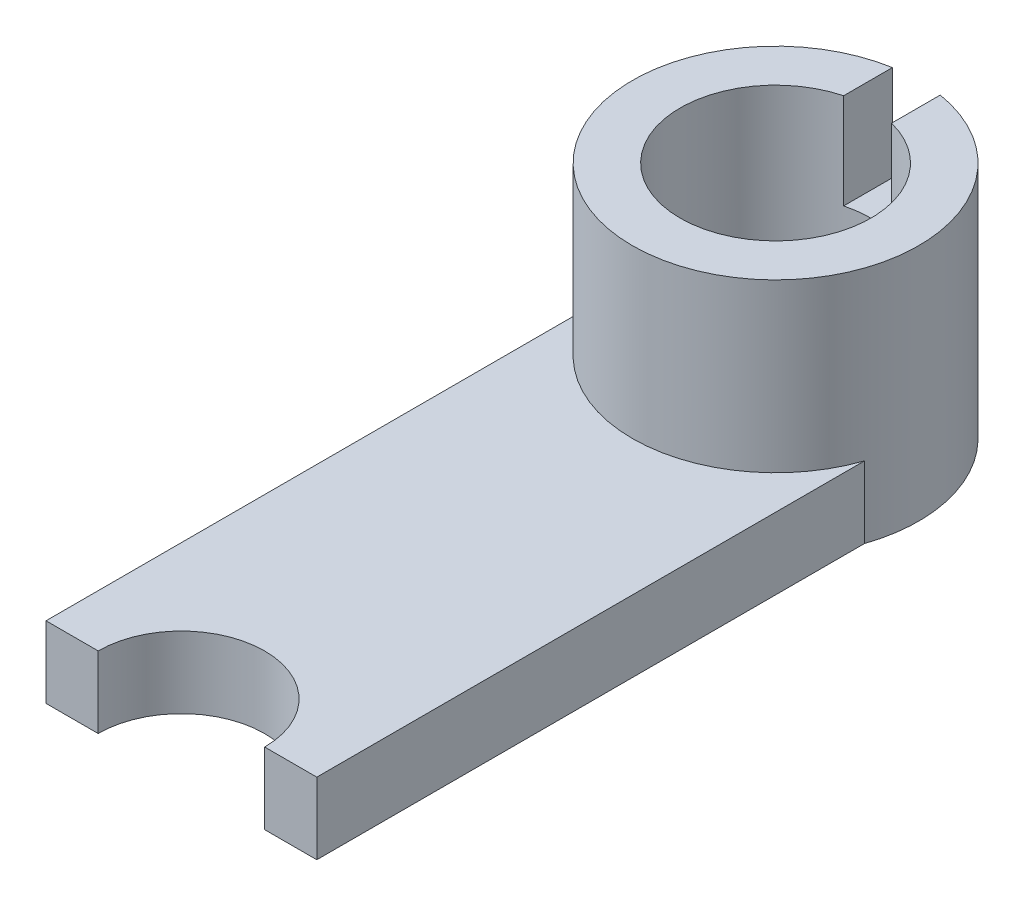
ISO-10303-21;
HEADER;
FILE_DESCRIPTION(('STEP AP214'),'2;1');
FILE_NAME('part.step','',(''),(''),'','','');
FILE_SCHEMA(('AUTOMOTIVE_DESIGN { 1 0 10303 214 1 1 1 1 }'));
ENDSEC;
DATA;
#1=APPLICATION_CONTEXT('core data for automotive mechanical design processes');
#2=APPLICATION_PROTOCOL_DEFINITION('international standard','automotive_design',2000,#1);
#3=PRODUCT_CONTEXT('',#1,'mechanical');
#4=PRODUCT('Part','Part','',(#3));
#5=PRODUCT_RELATED_PRODUCT_CATEGORY('part','',(#4));
#6=PRODUCT_DEFINITION_FORMATION('','',#4);
#7=PRODUCT_DEFINITION_CONTEXT('part definition',#1,'design');
#8=PRODUCT_DEFINITION('design','',#6,#7);
#9=PRODUCT_DEFINITION_SHAPE('','',#8);
#10=(LENGTH_UNIT() NAMED_UNIT(*) SI_UNIT(.MILLI.,.METRE.));
#11=(NAMED_UNIT(*) PLANE_ANGLE_UNIT() SI_UNIT($,.RADIAN.));
#12=(NAMED_UNIT(*) SI_UNIT($,.STERADIAN.) SOLID_ANGLE_UNIT());
#13=UNCERTAINTY_MEASURE_WITH_UNIT(LENGTH_MEASURE(1.E-05),#10,'distance_accuracy_value','');
#14=(GEOMETRIC_REPRESENTATION_CONTEXT(3) GLOBAL_UNCERTAINTY_ASSIGNED_CONTEXT((#13)) GLOBAL_UNIT_ASSIGNED_CONTEXT((#10,
#11,#12)) REPRESENTATION_CONTEXT('',''));
#15=CARTESIAN_POINT('',(0.,0.,0.));
#16=DIRECTION('',(0.,0.,1.));
#17=DIRECTION('',(1.,0.,0.));
#18=AXIS2_PLACEMENT_3D('',#15,#16,#17);
#19=CARTESIAN_POINT('',(0.,0.,0.));
#20=DIRECTION('',(0.,1.,0.));
#21=DIRECTION('',(0.,0.,1.));
#22=AXIS2_PLACEMENT_3D('',#19,#20,#21);
#23=PLANE('',#22);
#24=CARTESIAN_POINT('',(0.,0.,249016.177020215));
#25=DIRECTION('',(0.,1.,0.));
#26=DIRECTION('',(0.,0.,1.));
#27=AXIS2_PLACEMENT_3D('',#24,#25,#26);
#28=CIRCLE('',#27,34880.8875306561);
#29=CARTESIAN_POINT('',(-34880.8875306561,0.,249016.177020215));
#30=VERTEX_POINT('',#29);
#31=CARTESIAN_POINT('',(34880.8875306561,0.,249016.177020215));
#32=VERTEX_POINT('',#31);
#33=EDGE_CURVE('E47',#30,#32,#28,.F.);
#34=ORIENTED_EDGE('',*,*,#33,.F.);
#35=DIRECTION('',(-1.,0.,0.));
#36=VECTOR('',#35,1.);
#37=CARTESIAN_POINT('',(56743.8198189779,0.,249016.177020215));
#38=LINE('',#37,#36);
#39=CARTESIAN_POINT('',(-56743.8198189779,0.,249016.177020215));
#40=VERTEX_POINT('',#39);
#41=EDGE_CURVE('E142',#30,#40,#38,.T.);
#42=ORIENTED_EDGE('',*,*,#41,.T.);
#43=DIRECTION('',(0.,0.,-1.));
#44=VECTOR('',#43,1.);
#45=CARTESIAN_POINT('',(-56743.8198189779,0.,249016.177020215));
#46=LINE('',#45,#44);
#47=CARTESIAN_POINT('',(-56743.8198189779,0.,19497.1513906872));
#48=VERTEX_POINT('',#47);
#49=EDGE_CURVE('E136',#40,#48,#46,.T.);
#50=ORIENTED_EDGE('',*,*,#49,.T.);
#51=CARTESIAN_POINT('',(0.,0.,0.));
#52=DIRECTION('',(0.,1.,0.));
#53=DIRECTION('',(0.,0.,1.));
#54=AXIS2_PLACEMENT_3D('',#51,#52,#53);
#55=CIRCLE('',#54,60000.);
#56=CARTESIAN_POINT('',(56743.8198189779,0.,19497.1513906872));
#57=VERTEX_POINT('',#56);
#58=EDGE_CURVE('E173',#57,#48,#55,.T.);
#59=ORIENTED_EDGE('',*,*,#58,.F.);
#60=DIRECTION('',(0.,0.,1.));
#61=VECTOR('',#60,1.);
#62=CARTESIAN_POINT('',(56743.8198189779,0.,249016.177020215));
#63=LINE('',#62,#61);
#64=CARTESIAN_POINT('',(56743.8198189779,0.,249016.177020215));
#65=VERTEX_POINT('',#64);
#66=EDGE_CURVE('E139',#57,#65,#63,.T.);
#67=ORIENTED_EDGE('',*,*,#66,.T.);
#68=EDGE_CURVE('E143',#65,#32,#38,.T.);
#69=ORIENTED_EDGE('',*,*,#68,.T.);
#70=EDGE_LOOP('',(#34,#42,#50,#59,#67,#69));
#71=FACE_BOUND('',#70,.T.);
#72=CARTESIAN_POINT('',(0.,0.,0.));
#73=DIRECTION('',(0.,1.,0.));
#74=DIRECTION('',(0.,0.,1.));
#75=AXIS2_PLACEMENT_3D('',#72,#73,#74);
#76=CIRCLE('',#75,40000.);
#77=CARTESIAN_POINT('',(0.,0.,40000.));
#78=VERTEX_POINT('',#77);
#79=EDGE_CURVE('E169',#78,#78,#76,.T.);
#80=ORIENTED_EDGE('',*,*,#79,.T.);
#81=EDGE_LOOP('',(#80));
#82=FACE_BOUND('',#81,.T.);
#83=ADVANCED_FACE('F32',(#71,#82),#23,.F.);
#84=CARTESIAN_POINT('',(0.,30000.,0.));
#85=DIRECTION('',(0.,1.,0.));
#86=DIRECTION('',(0.,0.,1.));
#87=AXIS2_PLACEMENT_3D('',#84,#85,#86);
#88=PLANE('',#87);
#89=DIRECTION('',(-1.,0.,0.));
#90=VECTOR('',#89,1.);
#91=CARTESIAN_POINT('',(56743.8198189779,30000.,249016.177020215));
#92=LINE('',#91,#90);
#93=CARTESIAN_POINT('',(-34880.8875306561,30000.,249016.177020215));
#94=VERTEX_POINT('',#93);
#95=CARTESIAN_POINT('',(-56743.8198189779,30000.,249016.177020215));
#96=VERTEX_POINT('',#95);
#97=EDGE_CURVE('E122',#94,#96,#92,.T.);
#98=ORIENTED_EDGE('',*,*,#97,.F.);
#99=CARTESIAN_POINT('',(0.,30000.,249016.177020215));
#100=DIRECTION('',(0.,1.,0.));
#101=DIRECTION('',(0.,0.,1.));
#102=AXIS2_PLACEMENT_3D('',#99,#100,#101);
#103=CIRCLE('',#102,34880.8875306561);
#104=CARTESIAN_POINT('',(34880.8875306561,30000.,249016.177020215));
#105=VERTEX_POINT('',#104);
#106=EDGE_CURVE('E109',#94,#105,#103,.F.);
#107=ORIENTED_EDGE('',*,*,#106,.T.);
#108=CARTESIAN_POINT('',(56743.8198189779,30000.,249016.177020215));
#109=VERTEX_POINT('',#108);
#110=EDGE_CURVE('E120',#109,#105,#92,.T.);
#111=ORIENTED_EDGE('',*,*,#110,.F.);
#112=DIRECTION('',(0.,0.,1.));
#113=VECTOR('',#112,1.);
#114=CARTESIAN_POINT('',(56743.8198189779,30000.,249016.177020215));
#115=LINE('',#114,#113);
#116=CARTESIAN_POINT('',(56743.8198189779,30000.,19497.1513906872));
#117=VERTEX_POINT('',#116);
#118=EDGE_CURVE('E132',#117,#109,#115,.T.);
#119=ORIENTED_EDGE('',*,*,#118,.F.);
#120=CARTESIAN_POINT('',(0.,30000.,0.));
#121=DIRECTION('',(0.,1.,0.));
#122=DIRECTION('',(0.,0.,1.));
#123=AXIS2_PLACEMENT_3D('',#120,#121,#122);
#124=CIRCLE('',#123,60000.);
#125=CARTESIAN_POINT('',(-56743.8198189779,30000.,19497.1513906872));
#126=VERTEX_POINT('',#125);
#127=EDGE_CURVE('E55',#126,#117,#124,.T.);
#128=ORIENTED_EDGE('',*,*,#127,.F.);
#129=DIRECTION('',(0.,0.,-1.));
#130=VECTOR('',#129,1.);
#131=CARTESIAN_POINT('',(-56743.8198189779,30000.,249016.177020215));
#132=LINE('',#131,#130);
#133=EDGE_CURVE('E145',#96,#126,#132,.T.);
#134=ORIENTED_EDGE('',*,*,#133,.F.);
#135=EDGE_LOOP('',(#98,#107,#111,#119,#128,#134));
#136=FACE_BOUND('',#135,.T.);
#137=ADVANCED_FACE('F118',(#136),#88,.T.);
#138=CARTESIAN_POINT('',(56743.8198189779,30000.,249016.177020215));
#139=DIRECTION('',(0.,0.,1.));
#140=DIRECTION('',(1.,0.,0.));
#141=AXIS2_PLACEMENT_3D('',#138,#139,#140);
#142=PLANE('',#141);
#143=ORIENTED_EDGE('',*,*,#41,.F.);
#144=DIRECTION('',(0.,-1.,0.));
#145=VECTOR('',#144,1.);
#146=CARTESIAN_POINT('',(-34880.8875306561,58505.,249016.177020215));
#147=LINE('',#146,#145);
#148=EDGE_CURVE('E11',#30,#94,#147,.F.);
#149=ORIENTED_EDGE('',*,*,#148,.T.);
#150=ORIENTED_EDGE('',*,*,#97,.T.);
#151=DIRECTION('',(0.,-1.,0.));
#152=VECTOR('',#151,1.);
#153=CARTESIAN_POINT('',(-56743.8198189779,30000.,249016.177020215));
#154=LINE('',#153,#152);
#155=EDGE_CURVE('E146',#96,#40,#154,.T.);
#156=ORIENTED_EDGE('',*,*,#155,.T.);
#157=EDGE_LOOP('',(#143,#149,#150,#156));
#158=FACE_BOUND('',#157,.T.);
#159=ADVANCED_FACE('F221',(#158),#142,.T.);
#160=ORIENTED_EDGE('',*,*,#110,.T.);
#161=DIRECTION('',(0.,-1.,0.));
#162=VECTOR('',#161,1.);
#163=CARTESIAN_POINT('',(34880.8875306561,58505.,249016.177020215));
#164=LINE('',#163,#162);
#165=EDGE_CURVE('E40',#105,#32,#164,.T.);
#166=ORIENTED_EDGE('',*,*,#165,.T.);
#167=ORIENTED_EDGE('',*,*,#68,.F.);
#168=DIRECTION('',(0.,-1.,0.));
#169=VECTOR('',#168,1.);
#170=CARTESIAN_POINT('',(56743.8198189779,30000.,249016.177020215));
#171=LINE('',#170,#169);
#172=EDGE_CURVE('E125',#109,#65,#171,.T.);
#173=ORIENTED_EDGE('',*,*,#172,.F.);
#174=EDGE_LOOP('',(#160,#166,#167,#173));
#175=FACE_BOUND('',#174,.T.);
#176=ADVANCED_FACE('F124',(#175),#142,.T.);
#177=CARTESIAN_POINT('',(0.,100000.,0.));
#178=DIRECTION('',(0.,1.,0.));
#179=DIRECTION('',(0.,0.,1.));
#180=AXIS2_PLACEMENT_3D('',#177,#178,#179);
#181=PLANE('',#180);
#182=CARTESIAN_POINT('',(0.,100000.,0.));
#183=DIRECTION('',(0.,1.,0.));
#184=DIRECTION('',(0.,0.,1.));
#185=AXIS2_PLACEMENT_3D('',#182,#183,#184);
#186=CIRCLE('',#185,60000.);
#187=CARTESIAN_POINT('',(-10166.3729458625,100000.,-59132.4349331704));
#188=VERTEX_POINT('',#187);
#189=CARTESIAN_POINT('',(9833.62705413754,100000.,-59188.6794831591));
#190=VERTEX_POINT('',#189);
#191=EDGE_CURVE('E176',#188,#190,#186,.T.);
#192=ORIENTED_EDGE('',*,*,#191,.T.);
#193=DIRECTION('',(0.,0.,1.));
#194=VECTOR('',#193,1.);
#195=CARTESIAN_POINT('',(9833.62705413755,100000.,-1.29991574545201E-12));
#196=LINE('',#195,#194);
#197=CARTESIAN_POINT('',(9833.62705413754,100000.,-38772.4100225938));
#198=VERTEX_POINT('',#197);
#199=EDGE_CURVE('E164',#190,#198,#196,.T.);
#200=ORIENTED_EDGE('',*,*,#199,.T.);
#201=CARTESIAN_POINT('',(0.,100000.,0.));
#202=DIRECTION('',(0.,1.,0.));
#203=DIRECTION('',(0.,0.,1.));
#204=AXIS2_PLACEMENT_3D('',#201,#202,#203);
#205=CIRCLE('',#204,40000.);
#206=CARTESIAN_POINT('',(-10166.3729458625,100000.,-38686.4945572177));
#207=VERTEX_POINT('',#206);
#208=EDGE_CURVE('E170',#207,#198,#205,.T.);
#209=ORIENTED_EDGE('',*,*,#208,.F.);
#210=DIRECTION('',(0.,0.,-1.));
#211=VECTOR('',#210,1.);
#212=CARTESIAN_POINT('',(-10166.3729458625,100000.,0.));
#213=LINE('',#212,#211);
#214=EDGE_CURVE('E159',#207,#188,#213,.T.);
#215=ORIENTED_EDGE('',*,*,#214,.T.);
#216=EDGE_LOOP('',(#192,#200,#209,#215));
#217=FACE_BOUND('',#216,.T.);
#218=ADVANCED_FACE('F203',(#217),#181,.T.);
#219=CARTESIAN_POINT('',(0.,100000.,0.));
#220=DIRECTION('',(0.,-1.,0.));
#221=DIRECTION('',(0.,0.,-1.));
#222=AXIS2_PLACEMENT_3D('',#219,#220,#221);
#223=CYLINDRICAL_SURFACE('',#222,60000.);
#224=ORIENTED_EDGE('',*,*,#127,.T.);
#225=DIRECTION('',(0.,-1.,0.));
#226=VECTOR('',#225,1.);
#227=CARTESIAN_POINT('',(56743.8198189779,30000.,19497.1513906872));
#228=LINE('',#227,#226);
#229=EDGE_CURVE('E130',#117,#57,#228,.T.);
#230=ORIENTED_EDGE('',*,*,#229,.T.);
#231=ORIENTED_EDGE('',*,*,#58,.T.);
#232=DIRECTION('',(0.,-1.,0.));
#233=VECTOR('',#232,1.);
#234=CARTESIAN_POINT('',(-56743.8198189779,30000.,19497.1513906872));
#235=LINE('',#234,#233);
#236=EDGE_CURVE('E127',#126,#48,#235,.T.);
#237=ORIENTED_EDGE('',*,*,#236,.F.);
#238=EDGE_LOOP('',(#224,#230,#231,#237));
#239=FACE_BOUND('',#238,.T.);
#240=DIRECTION('',(0.,-1.,0.));
#241=VECTOR('',#240,1.);
#242=CARTESIAN_POINT('',(9833.62705413754,100000.,-59188.6794831591));
#243=LINE('',#242,#241);
#244=CARTESIAN_POINT('',(9833.62705413754,60000.,-59188.6794831591));
#245=VERTEX_POINT('',#244);
#246=EDGE_CURVE('E167',#190,#245,#243,.T.);
#247=ORIENTED_EDGE('',*,*,#246,.F.);
#248=ORIENTED_EDGE('',*,*,#191,.F.);
#249=DIRECTION('',(0.,-1.,0.));
#250=VECTOR('',#249,1.);
#251=CARTESIAN_POINT('',(-10166.3729458625,100000.,-59132.4349331704));
#252=LINE('',#251,#250);
#253=CARTESIAN_POINT('',(-10166.3729458625,60000.,-59132.4349331704));
#254=VERTEX_POINT('',#253);
#255=EDGE_CURVE('E162',#254,#188,#252,.F.);
#256=ORIENTED_EDGE('',*,*,#255,.F.);
#257=CARTESIAN_POINT('',(0.,60000.,0.));
#258=DIRECTION('',(0.,1.,0.));
#259=DIRECTION('',(0.,0.,1.));
#260=AXIS2_PLACEMENT_3D('',#257,#258,#259);
#261=CIRCLE('',#260,60000.);
#262=EDGE_CURVE('E157',#245,#254,#261,.T.);
#263=ORIENTED_EDGE('',*,*,#262,.F.);
#264=EDGE_LOOP('',(#247,#248,#256,#263));
#265=FACE_BOUND('',#264,.T.);
#266=ADVANCED_FACE('F34',(#239,#265),#223,.T.);
#267=CARTESIAN_POINT('',(0.,100000.,0.));
#268=DIRECTION('',(0.,-1.,0.));
#269=DIRECTION('',(0.,0.,-1.));
#270=AXIS2_PLACEMENT_3D('',#267,#268,#269);
#271=CYLINDRICAL_SURFACE('',#270,40000.);
#272=DIRECTION('',(0.,-1.,0.));
#273=VECTOR('',#272,1.);
#274=CARTESIAN_POINT('',(9833.62705413754,100000.,-38772.4100225938));
#275=LINE('',#274,#273);
#276=CARTESIAN_POINT('',(9833.62705413754,60000.,-38772.4100225938));
#277=VERTEX_POINT('',#276);
#278=EDGE_CURVE('E114',#198,#277,#275,.T.);
#279=ORIENTED_EDGE('',*,*,#278,.T.);
#280=CARTESIAN_POINT('',(0.,60000.,0.));
#281=DIRECTION('',(0.,1.,0.));
#282=DIRECTION('',(0.,0.,1.));
#283=AXIS2_PLACEMENT_3D('',#280,#281,#282);
#284=CIRCLE('',#283,40000.);
#285=CARTESIAN_POINT('',(-10166.3729458625,60000.,-38686.4945572177));
#286=VERTEX_POINT('',#285);
#287=EDGE_CURVE('E179',#277,#286,#284,.T.);
#288=ORIENTED_EDGE('',*,*,#287,.T.);
#289=DIRECTION('',(0.,-1.,0.));
#290=VECTOR('',#289,1.);
#291=CARTESIAN_POINT('',(-10166.3729458625,100000.,-38686.4945572177));
#292=LINE('',#291,#290);
#293=EDGE_CURVE('E183',#286,#207,#292,.F.);
#294=ORIENTED_EDGE('',*,*,#293,.T.);
#295=ORIENTED_EDGE('',*,*,#208,.T.);
#296=EDGE_LOOP('',(#279,#288,#294,#295));
#297=FACE_BOUND('',#296,.T.);
#298=ORIENTED_EDGE('',*,*,#79,.F.);
#299=EDGE_LOOP('',(#298));
#300=FACE_BOUND('',#299,.T.);
#301=ADVANCED_FACE('F187',(#297,#300),#271,.F.);
#302=CARTESIAN_POINT('',(9833.62705413754,114630.,-61934.6879297899));
#303=DIRECTION('',(-1.,0.,0.));
#304=DIRECTION('',(0.,0.,1.));
#305=AXIS2_PLACEMENT_3D('',#302,#303,#304);
#306=PLANE('',#305);
#307=ORIENTED_EDGE('',*,*,#246,.T.);
#308=DIRECTION('',(0.,0.,-1.));
#309=VECTOR('',#308,1.);
#310=CARTESIAN_POINT('',(9833.62705413754,60000.,-61934.6879297899));
#311=LINE('',#310,#309);
#312=EDGE_CURVE('E152',#277,#245,#311,.T.);
#313=ORIENTED_EDGE('',*,*,#312,.F.);
#314=ORIENTED_EDGE('',*,*,#278,.F.);
#315=ORIENTED_EDGE('',*,*,#199,.F.);
#316=EDGE_LOOP('',(#307,#313,#314,#315));
#317=FACE_BOUND('',#316,.T.);
#318=ADVANCED_FACE('F197',(#317),#306,.T.);
#319=CARTESIAN_POINT('',(-10166.3729458625,114630.,-61934.6879297899));
#320=DIRECTION('',(1.,0.,0.));
#321=DIRECTION('',(0.,0.,-1.));
#322=AXIS2_PLACEMENT_3D('',#319,#320,#321);
#323=PLANE('',#322);
#324=ORIENTED_EDGE('',*,*,#255,.T.);
#325=ORIENTED_EDGE('',*,*,#214,.F.);
#326=ORIENTED_EDGE('',*,*,#293,.F.);
#327=DIRECTION('',(0.,0.,1.));
#328=VECTOR('',#327,1.);
#329=CARTESIAN_POINT('',(-10166.3729458625,60000.,-61934.6879297899));
#330=LINE('',#329,#328);
#331=EDGE_CURVE('E155',#254,#286,#330,.T.);
#332=ORIENTED_EDGE('',*,*,#331,.F.);
#333=EDGE_LOOP('',(#324,#325,#326,#332));
#334=FACE_BOUND('',#333,.T.);
#335=ADVANCED_FACE('F206',(#334),#323,.T.);
#336=CARTESIAN_POINT('',(0.,60000.,0.));
#337=DIRECTION('',(0.,1.,0.));
#338=DIRECTION('',(0.,0.,1.));
#339=AXIS2_PLACEMENT_3D('',#336,#337,#338);
#340=PLANE('',#339);
#341=ORIENTED_EDGE('',*,*,#262,.T.);
#342=ORIENTED_EDGE('',*,*,#331,.T.);
#343=ORIENTED_EDGE('',*,*,#287,.F.);
#344=ORIENTED_EDGE('',*,*,#312,.T.);
#345=EDGE_LOOP('',(#341,#342,#343,#344));
#346=FACE_BOUND('',#345,.T.);
#347=ADVANCED_FACE('F193',(#346),#340,.T.);
#348=CARTESIAN_POINT('',(-56743.8198189779,30000.,249016.177020215));
#349=DIRECTION('',(-1.,0.,0.));
#350=DIRECTION('',(0.,0.,1.));
#351=AXIS2_PLACEMENT_3D('',#348,#349,#350);
#352=PLANE('',#351);
#353=ORIENTED_EDGE('',*,*,#49,.F.);
#354=ORIENTED_EDGE('',*,*,#155,.F.);
#355=ORIENTED_EDGE('',*,*,#133,.T.);
#356=ORIENTED_EDGE('',*,*,#236,.T.);
#357=EDGE_LOOP('',(#353,#354,#355,#356));
#358=FACE_BOUND('',#357,.T.);
#359=ADVANCED_FACE('F213',(#358),#352,.T.);
#360=CARTESIAN_POINT('',(56743.8198189779,30000.,249016.177020215));
#361=DIRECTION('',(1.,0.,0.));
#362=DIRECTION('',(0.,0.,-1.));
#363=AXIS2_PLACEMENT_3D('',#360,#361,#362);
#364=PLANE('',#363);
#365=ORIENTED_EDGE('',*,*,#66,.F.);
#366=ORIENTED_EDGE('',*,*,#229,.F.);
#367=ORIENTED_EDGE('',*,*,#118,.T.);
#368=ORIENTED_EDGE('',*,*,#172,.T.);
#369=EDGE_LOOP('',(#365,#366,#367,#368));
#370=FACE_BOUND('',#369,.T.);
#371=ADVANCED_FACE('F262',(#370),#364,.T.);
#372=CARTESIAN_POINT('',(0.,58505.,249016.177020215));
#373=DIRECTION('',(0.,-1.,0.));
#374=DIRECTION('',(0.,0.,-1.));
#375=AXIS2_PLACEMENT_3D('',#372,#373,#374);
#376=CYLINDRICAL_SURFACE('',#375,34880.8875306561);
#377=ORIENTED_EDGE('',*,*,#33,.T.);
#378=ORIENTED_EDGE('',*,*,#165,.F.);
#379=ORIENTED_EDGE('',*,*,#106,.F.);
#380=ORIENTED_EDGE('',*,*,#148,.F.);
#381=EDGE_LOOP('',(#377,#378,#379,#380));
#382=FACE_BOUND('',#381,.T.);
#383=ADVANCED_FACE('F108',(#382),#376,.F.);
#384=CLOSED_SHELL('',(#83,#137,#159,#176,#218,#266,#301,#318,#335,#347,#359,#371,#383));
#385=MANIFOLD_SOLID_BREP('B2',#384);
#386=ADVANCED_BREP_SHAPE_REPRESENTATION('',(#18,#385),#14);
#387=SHAPE_DEFINITION_REPRESENTATION(#9,#386);
ENDSEC;
END-ISO-10303-21;
